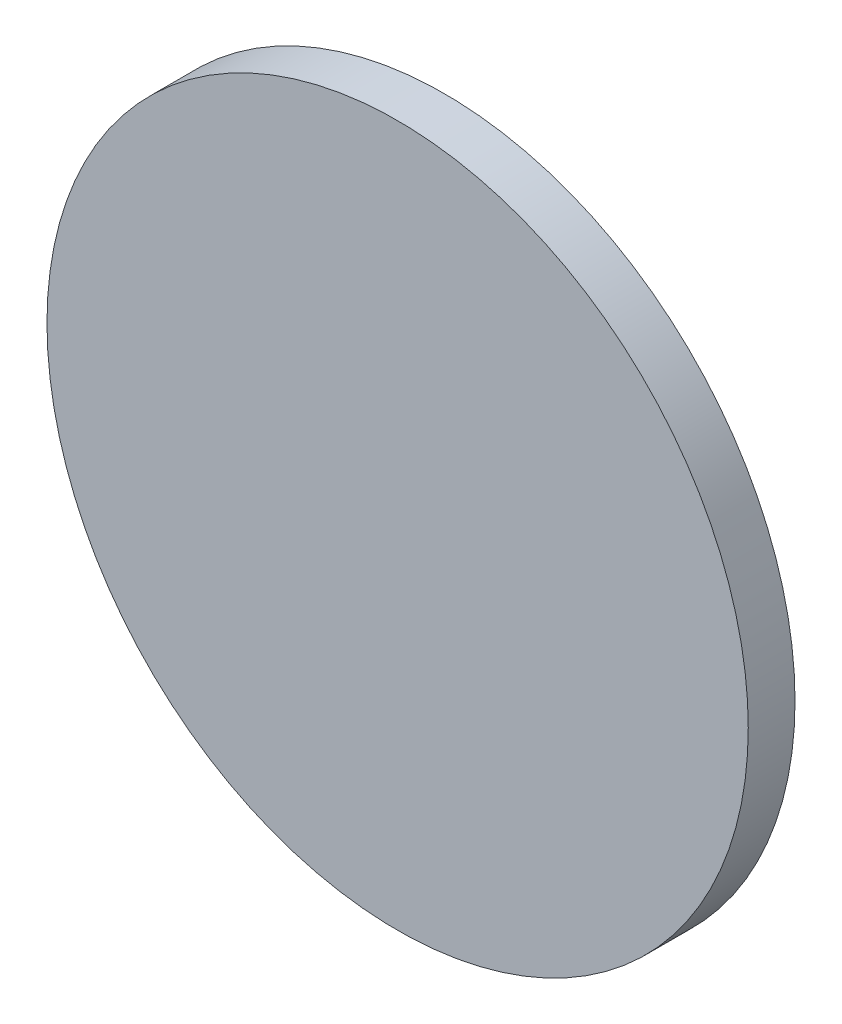
ISO-10303-21;
HEADER;
FILE_DESCRIPTION(('STEP AP214'),'2;1');
FILE_NAME('part.step','',(''),(''),'','','');
FILE_SCHEMA(('AUTOMOTIVE_DESIGN { 1 0 10303 214 1 1 1 1 }'));
ENDSEC;
DATA;
#1=APPLICATION_CONTEXT('core data for automotive mechanical design processes');
#2=APPLICATION_PROTOCOL_DEFINITION('international standard','automotive_design',2000,#1);
#3=PRODUCT_CONTEXT('',#1,'mechanical');
#4=PRODUCT('Part','Part','',(#3));
#5=PRODUCT_RELATED_PRODUCT_CATEGORY('part','',(#4));
#6=PRODUCT_DEFINITION_FORMATION('','',#4);
#7=PRODUCT_DEFINITION_CONTEXT('part definition',#1,'design');
#8=PRODUCT_DEFINITION('design','',#6,#7);
#9=PRODUCT_DEFINITION_SHAPE('','',#8);
#10=(LENGTH_UNIT() NAMED_UNIT(*) SI_UNIT(.MILLI.,.METRE.));
#11=(NAMED_UNIT(*) PLANE_ANGLE_UNIT() SI_UNIT($,.RADIAN.));
#12=(NAMED_UNIT(*) SI_UNIT($,.STERADIAN.) SOLID_ANGLE_UNIT());
#13=UNCERTAINTY_MEASURE_WITH_UNIT(LENGTH_MEASURE(1.E-05),#10,'distance_accuracy_value','');
#14=(GEOMETRIC_REPRESENTATION_CONTEXT(3) GLOBAL_UNCERTAINTY_ASSIGNED_CONTEXT((#13)) GLOBAL_UNIT_ASSIGNED_CONTEXT((#10,
#11,#12)) REPRESENTATION_CONTEXT('',''));
#15=CARTESIAN_POINT('',(0.,0.,0.));
#16=DIRECTION('',(0.,0.,1.));
#17=DIRECTION('',(1.,0.,0.));
#18=AXIS2_PLACEMENT_3D('',#15,#16,#17);
#19=CARTESIAN_POINT('',(0.,0.,4.00115381264575));
#20=DIRECTION('',(0.,0.,-1.));
#21=DIRECTION('',(-1.,0.,0.));
#22=AXIS2_PLACEMENT_3D('',#19,#20,#21);
#23=CYLINDRICAL_SURFACE('',#22,30.);
#24=CARTESIAN_POINT('',(0.,0.,4.00115381264575));
#25=DIRECTION('',(0.,0.,1.));
#26=DIRECTION('',(1.,0.,0.));
#27=AXIS2_PLACEMENT_3D('',#24,#25,#26);
#28=CIRCLE('',#27,30.);
#29=CARTESIAN_POINT('',(30.,0.,4.00115381264575));
#30=VERTEX_POINT('',#29);
#31=EDGE_CURVE('E10',#30,#30,#28,.T.);
#32=ORIENTED_EDGE('',*,*,#31,.F.);
#33=EDGE_LOOP('',(#32));
#34=FACE_BOUND('',#33,.T.);
#35=CARTESIAN_POINT('',(0.,0.,0.));
#36=DIRECTION('',(0.,0.,1.));
#37=DIRECTION('',(1.,0.,0.));
#38=AXIS2_PLACEMENT_3D('',#35,#36,#37);
#39=CIRCLE('',#38,30.);
#40=CARTESIAN_POINT('',(30.,0.,0.));
#41=VERTEX_POINT('',#40);
#42=EDGE_CURVE('E38',#41,#41,#39,.T.);
#43=ORIENTED_EDGE('',*,*,#42,.T.);
#44=EDGE_LOOP('',(#43));
#45=FACE_BOUND('',#44,.T.);
#46=ADVANCED_FACE('F35',(#34,#45),#23,.T.);
#47=CARTESIAN_POINT('',(0.,0.,4.00115381264575));
#48=DIRECTION('',(0.,0.,1.));
#49=DIRECTION('',(1.,0.,0.));
#50=AXIS2_PLACEMENT_3D('',#47,#48,#49);
#51=PLANE('',#50);
#52=ORIENTED_EDGE('',*,*,#31,.T.);
#53=EDGE_LOOP('',(#52));
#54=FACE_BOUND('',#53,.T.);
#55=ADVANCED_FACE('F50',(#54),#51,.T.);
#56=CARTESIAN_POINT('',(0.,0.,0.));
#57=DIRECTION('',(0.,0.,1.));
#58=DIRECTION('',(1.,0.,0.));
#59=AXIS2_PLACEMENT_3D('',#56,#57,#58);
#60=PLANE('',#59);
#61=ORIENTED_EDGE('',*,*,#42,.F.);
#62=EDGE_LOOP('',(#61));
#63=FACE_BOUND('',#62,.T.);
#64=ADVANCED_FACE('F48',(#63),#60,.F.);
#65=CLOSED_SHELL('',(#46,#55,#64));
#66=MANIFOLD_SOLID_BREP('B2',#65);
#67=ADVANCED_BREP_SHAPE_REPRESENTATION('',(#18,#66),#14);
#68=SHAPE_DEFINITION_REPRESENTATION(#9,#67);
ENDSEC;
END-ISO-10303-21;
